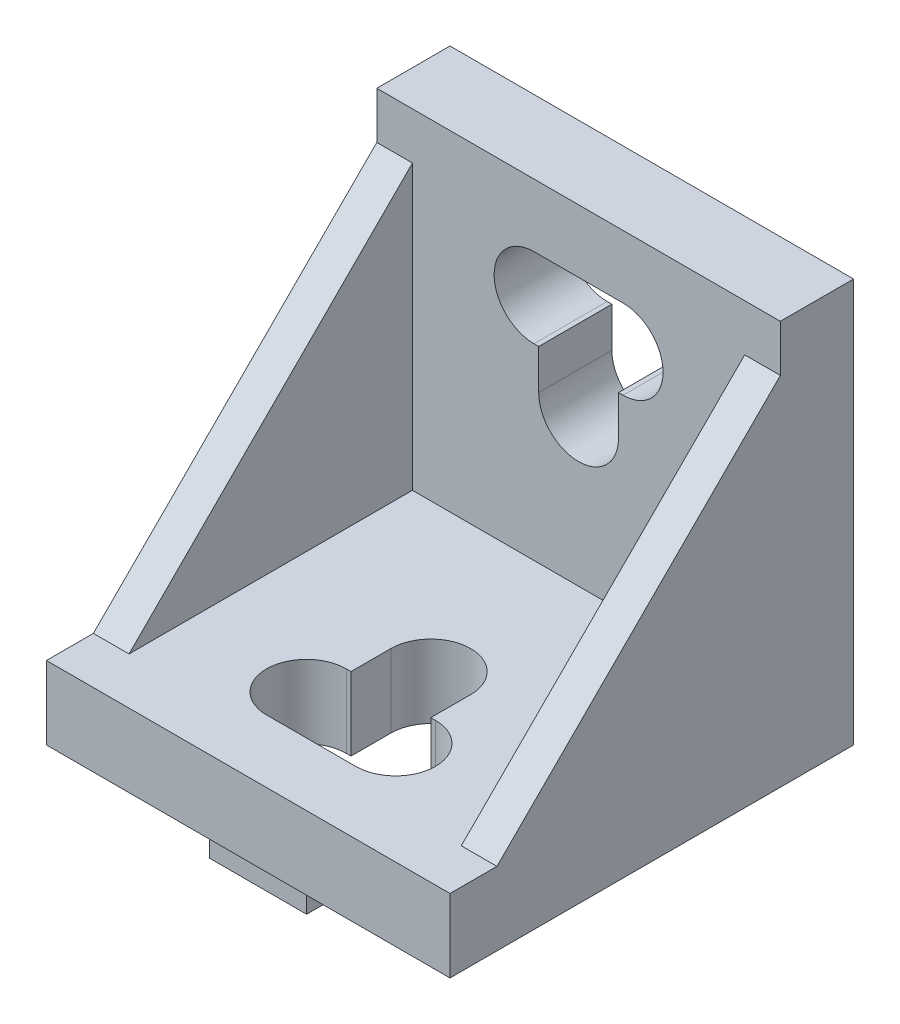
ISO-10303-21;
HEADER;
FILE_DESCRIPTION(('STEP AP214'),'2;1');
FILE_NAME('part.step','',(''),(''),'','','');
FILE_SCHEMA(('AUTOMOTIVE_DESIGN { 1 0 10303 214 1 1 1 1 }'));
ENDSEC;
DATA;
#1=APPLICATION_CONTEXT('core data for automotive mechanical design processes');
#2=APPLICATION_PROTOCOL_DEFINITION('international standard','automotive_design',2000,#1);
#3=PRODUCT_CONTEXT('',#1,'mechanical');
#4=PRODUCT('Part','Part','',(#3));
#5=PRODUCT_RELATED_PRODUCT_CATEGORY('part','',(#4));
#6=PRODUCT_DEFINITION_FORMATION('','',#4);
#7=PRODUCT_DEFINITION_CONTEXT('part definition',#1,'design');
#8=PRODUCT_DEFINITION('design','',#6,#7);
#9=PRODUCT_DEFINITION_SHAPE('','',#8);
#10=(LENGTH_UNIT() NAMED_UNIT(*) SI_UNIT(.MILLI.,.METRE.));
#11=(NAMED_UNIT(*) PLANE_ANGLE_UNIT() SI_UNIT($,.RADIAN.));
#12=(NAMED_UNIT(*) SI_UNIT($,.STERADIAN.) SOLID_ANGLE_UNIT());
#13=UNCERTAINTY_MEASURE_WITH_UNIT(LENGTH_MEASURE(1.E-05),#10,'distance_accuracy_value','');
#14=(GEOMETRIC_REPRESENTATION_CONTEXT(3) GLOBAL_UNCERTAINTY_ASSIGNED_CONTEXT((#13)) GLOBAL_UNIT_ASSIGNED_CONTEXT((#10,
#11,#12)) REPRESENTATION_CONTEXT('',''));
#15=CARTESIAN_POINT('',(0.,0.,0.));
#16=DIRECTION('',(0.,0.,1.));
#17=DIRECTION('',(1.,0.,0.));
#18=AXIS2_PLACEMENT_3D('',#15,#16,#17);
#19=CARTESIAN_POINT('',(-21.5,-21.5,7.8));
#20=DIRECTION('',(0.,1.,0.));
#21=DIRECTION('',(0.,0.,1.));
#22=AXIS2_PLACEMENT_3D('',#19,#20,#21);
#23=PLANE('',#22);
#24=CARTESIAN_POINT('',(0.,-21.5,23.55));
#25=DIRECTION('',(0.,-1.,0.));
#26=DIRECTION('',(1.,0.,0.));
#27=AXIS2_PLACEMENT_3D('',#24,#25,#26);
#28=CIRCLE('',#27,4.25);
#29=CARTESIAN_POINT('',(-4.25,-21.5,23.55));
#30=VERTEX_POINT('',#29);
#31=CARTESIAN_POINT('',(4.25,-21.5,23.55));
#32=VERTEX_POINT('',#31);
#33=EDGE_CURVE('E262',#30,#32,#28,.T.);
#34=ORIENTED_EDGE('',*,*,#33,.F.);
#35=DIRECTION('',(0.,0.,-1.));
#36=VECTOR('',#35,1.);
#37=CARTESIAN_POINT('',(-4.25,-21.5,23.55));
#38=LINE('',#37,#36);
#39=CARTESIAN_POINT('',(-4.25,-21.5,27.8));
#40=VERTEX_POINT('',#39);
#41=EDGE_CURVE('E264',#40,#30,#38,.T.);
#42=ORIENTED_EDGE('',*,*,#41,.F.);
#43=DIRECTION('',(1.,0.,0.));
#44=VECTOR('',#43,1.);
#45=CARTESIAN_POINT('',(-4.25,-21.5,27.8));
#46=LINE('',#45,#44);
#47=CARTESIAN_POINT('',(-4.75,-21.5,27.8));
#48=VERTEX_POINT('',#47);
#49=EDGE_CURVE('E267',#48,#40,#46,.T.);
#50=ORIENTED_EDGE('',*,*,#49,.F.);
#51=CARTESIAN_POINT('',(-4.75,-21.5,32.05));
#52=DIRECTION('',(0.,-1.,0.));
#53=DIRECTION('',(1.,0.,0.));
#54=AXIS2_PLACEMENT_3D('',#51,#52,#53);
#55=CIRCLE('',#54,4.25);
#56=CARTESIAN_POINT('',(-4.75,-21.5,36.3));
#57=VERTEX_POINT('',#56);
#58=EDGE_CURVE('E270',#57,#48,#55,.T.);
#59=ORIENTED_EDGE('',*,*,#58,.F.);
#60=DIRECTION('',(-1.,0.,0.));
#61=VECTOR('',#60,1.);
#62=CARTESIAN_POINT('',(4.75,-21.5,36.3));
#63=LINE('',#62,#61);
#64=CARTESIAN_POINT('',(4.75,-21.5,36.3));
#65=VERTEX_POINT('',#64);
#66=EDGE_CURVE('E272',#65,#57,#63,.T.);
#67=ORIENTED_EDGE('',*,*,#66,.F.);
#68=CARTESIAN_POINT('',(4.75,-21.5,32.05));
#69=DIRECTION('',(0.,-1.,0.));
#70=DIRECTION('',(1.,0.,0.));
#71=AXIS2_PLACEMENT_3D('',#68,#69,#70);
#72=CIRCLE('',#71,4.25);
#73=CARTESIAN_POINT('',(4.75,-21.5,27.8));
#74=VERTEX_POINT('',#73);
#75=EDGE_CURVE('E274',#74,#65,#72,.T.);
#76=ORIENTED_EDGE('',*,*,#75,.F.);
#77=DIRECTION('',(1.,0.,0.));
#78=VECTOR('',#77,1.);
#79=CARTESIAN_POINT('',(4.75,-21.5,27.8));
#80=LINE('',#79,#78);
#81=CARTESIAN_POINT('',(4.25,-21.5,27.8));
#82=VERTEX_POINT('',#81);
#83=EDGE_CURVE('E276',#82,#74,#80,.T.);
#84=ORIENTED_EDGE('',*,*,#83,.F.);
#85=DIRECTION('',(0.,0.,1.));
#86=VECTOR('',#85,1.);
#87=CARTESIAN_POINT('',(4.25,-21.5,23.55));
#88=LINE('',#87,#86);
#89=EDGE_CURVE('E278',#32,#82,#88,.T.);
#90=ORIENTED_EDGE('',*,*,#89,.F.);
#91=EDGE_LOOP('',(#34,#42,#50,#59,#67,#76,#84,#90));
#92=FACE_BOUND('',#91,.T.);
#93=DIRECTION('',(1.,0.,0.));
#94=VECTOR('',#93,1.);
#95=CARTESIAN_POINT('',(-21.5,-21.5,0.));
#96=LINE('',#95,#94);
#97=CARTESIAN_POINT('',(-21.5,-21.5,0.));
#98=VERTEX_POINT('',#97);
#99=CARTESIAN_POINT('',(21.5,-21.5,0.));
#100=VERTEX_POINT('',#99);
#101=EDGE_CURVE('E436',#98,#100,#96,.T.);
#102=ORIENTED_EDGE('',*,*,#101,.T.);
#103=DIRECTION('',(0.,0.,-1.));
#104=VECTOR('',#103,1.);
#105=CARTESIAN_POINT('',(21.5,-21.5,7.8));
#106=LINE('',#105,#104);
#107=CARTESIAN_POINT('',(21.5,-21.5,43.));
#108=VERTEX_POINT('',#107);
#109=EDGE_CURVE('E441',#108,#100,#106,.T.);
#110=ORIENTED_EDGE('',*,*,#109,.F.);
#111=DIRECTION('',(-1.,0.,0.));
#112=VECTOR('',#111,1.);
#113=CARTESIAN_POINT('',(-21.5,-21.5,43.));
#114=LINE('',#113,#112);
#115=CARTESIAN_POINT('',(-21.5,-21.5,43.));
#116=VERTEX_POINT('',#115);
#117=EDGE_CURVE('E410',#108,#116,#114,.T.);
#118=ORIENTED_EDGE('',*,*,#117,.T.);
#119=DIRECTION('',(0.,0.,-1.));
#120=VECTOR('',#119,1.);
#121=CARTESIAN_POINT('',(-21.5,-21.5,7.8));
#122=LINE('',#121,#120);
#123=EDGE_CURVE('E450',#116,#98,#122,.T.);
#124=ORIENTED_EDGE('',*,*,#123,.T.);
#125=EDGE_LOOP('',(#102,#110,#118,#124));
#126=FACE_BOUND('',#125,.T.);
#127=DIRECTION('',(0.,0.,1.));
#128=VECTOR('',#127,1.);
#129=CARTESIAN_POINT('',(5.18251771749756,-21.5,41.9582928297311));
#130=LINE('',#129,#128);
#131=CARTESIAN_POINT('',(5.18251771749756,-21.5,39.1582928297312));
#132=VERTEX_POINT('',#131);
#133=CARTESIAN_POINT('',(5.18251771749756,-21.5,41.9582928297311));
#134=VERTEX_POINT('',#133);
#135=EDGE_CURVE('E252',#132,#134,#130,.T.);
#136=ORIENTED_EDGE('',*,*,#135,.F.);
#137=DIRECTION('',(1.,0.,0.));
#138=VECTOR('',#137,1.);
#139=CARTESIAN_POINT('',(-5.18251771749756,-21.5,39.1582928297312));
#140=LINE('',#139,#138);
#141=CARTESIAN_POINT('',(-5.18251771749756,-21.5,39.1582928297312));
#142=VERTEX_POINT('',#141);
#143=EDGE_CURVE('E249',#142,#132,#140,.T.);
#144=ORIENTED_EDGE('',*,*,#143,.F.);
#145=DIRECTION('',(0.,0.,-1.));
#146=VECTOR('',#145,1.);
#147=CARTESIAN_POINT('',(-5.18251771749756,-21.5,41.9582928297311));
#148=LINE('',#147,#146);
#149=CARTESIAN_POINT('',(-5.18251771749756,-21.5,41.9582928297311));
#150=VERTEX_POINT('',#149);
#151=EDGE_CURVE('E55',#150,#142,#148,.T.);
#152=ORIENTED_EDGE('',*,*,#151,.F.);
#153=DIRECTION('',(-1.,0.,0.));
#154=VECTOR('',#153,1.);
#155=CARTESIAN_POINT('',(-5.18251771749756,-21.5,41.9582928297311));
#156=LINE('',#155,#154);
#157=EDGE_CURVE('E50',#134,#150,#156,.T.);
#158=ORIENTED_EDGE('',*,*,#157,.F.);
#159=EDGE_LOOP('',(#136,#144,#152,#158));
#160=FACE_BOUND('',#159,.T.);
#161=ADVANCED_FACE('F35',(#92,#126,#160),#23,.F.);
#162=CARTESIAN_POINT('',(-21.5,-13.7,43.));
#163=DIRECTION('',(0.,1.,0.));
#164=DIRECTION('',(0.,0.,1.));
#165=AXIS2_PLACEMENT_3D('',#162,#163,#164);
#166=PLANE('',#165);
#167=DIRECTION('',(0.,0.,1.));
#168=VECTOR('',#167,1.);
#169=CARTESIAN_POINT('',(21.5,-13.7,0.));
#170=LINE('',#169,#168);
#171=CARTESIAN_POINT('',(21.5,-13.7,38.));
#172=VERTEX_POINT('',#171);
#173=CARTESIAN_POINT('',(21.5,-13.7,43.));
#174=VERTEX_POINT('',#173);
#175=EDGE_CURVE('E416',#172,#174,#170,.T.);
#176=ORIENTED_EDGE('',*,*,#175,.F.);
#177=DIRECTION('',(1.,0.,0.));
#178=VECTOR('',#177,1.);
#179=CARTESIAN_POINT('',(17.7,-13.7,38.));
#180=LINE('',#179,#178);
#181=CARTESIAN_POINT('',(17.7,-13.7,38.));
#182=VERTEX_POINT('',#181);
#183=EDGE_CURVE('E390',#182,#172,#180,.T.);
#184=ORIENTED_EDGE('',*,*,#183,.F.);
#185=DIRECTION('',(0.,0.,1.));
#186=VECTOR('',#185,1.);
#187=CARTESIAN_POINT('',(17.7,-13.7,7.8));
#188=LINE('',#187,#186);
#189=CARTESIAN_POINT('',(17.7,-13.7,7.8));
#190=VERTEX_POINT('',#189);
#191=EDGE_CURVE('E386',#190,#182,#188,.T.);
#192=ORIENTED_EDGE('',*,*,#191,.F.);
#193=DIRECTION('',(1.,0.,0.));
#194=VECTOR('',#193,1.);
#195=CARTESIAN_POINT('',(21.5,-13.7,7.8));
#196=LINE('',#195,#194);
#197=CARTESIAN_POINT('',(-17.7,-13.7,7.8));
#198=VERTEX_POINT('',#197);
#199=EDGE_CURVE('E427',#198,#190,#196,.T.);
#200=ORIENTED_EDGE('',*,*,#199,.F.);
#201=DIRECTION('',(0.,0.,1.));
#202=VECTOR('',#201,1.);
#203=CARTESIAN_POINT('',(-17.7,-13.7,7.8));
#204=LINE('',#203,#202);
#205=CARTESIAN_POINT('',(-17.7,-13.7,38.));
#206=VERTEX_POINT('',#205);
#207=EDGE_CURVE('E399',#198,#206,#204,.T.);
#208=ORIENTED_EDGE('',*,*,#207,.T.);
#209=DIRECTION('',(-1.,0.,0.));
#210=VECTOR('',#209,1.);
#211=CARTESIAN_POINT('',(-17.7,-13.7,38.));
#212=LINE('',#211,#210);
#213=CARTESIAN_POINT('',(-21.5,-13.7,38.));
#214=VERTEX_POINT('',#213);
#215=EDGE_CURVE('E405',#206,#214,#212,.T.);
#216=ORIENTED_EDGE('',*,*,#215,.T.);
#217=DIRECTION('',(0.,0.,-1.));
#218=VECTOR('',#217,1.);
#219=CARTESIAN_POINT('',(-21.5,-13.7,0.));
#220=LINE('',#219,#218);
#221=CARTESIAN_POINT('',(-21.5,-13.7,43.));
#222=VERTEX_POINT('',#221);
#223=EDGE_CURVE('E413',#222,#214,#220,.T.);
#224=ORIENTED_EDGE('',*,*,#223,.F.);
#225=DIRECTION('',(-1.,0.,0.));
#226=VECTOR('',#225,1.);
#227=CARTESIAN_POINT('',(-21.5,-13.7,43.));
#228=LINE('',#227,#226);
#229=EDGE_CURVE('E418',#174,#222,#228,.T.);
#230=ORIENTED_EDGE('',*,*,#229,.F.);
#231=EDGE_LOOP('',(#176,#184,#192,#200,#208,#216,#224,#230));
#232=FACE_BOUND('',#231,.T.);
#233=DIRECTION('',(0.,0.,-1.));
#234=VECTOR('',#233,1.);
#235=CARTESIAN_POINT('',(-4.25,-13.7,23.55));
#236=LINE('',#235,#234);
#237=CARTESIAN_POINT('',(-4.25,-13.7,27.8));
#238=VERTEX_POINT('',#237);
#239=CARTESIAN_POINT('',(-4.25,-13.7,23.55));
#240=VERTEX_POINT('',#239);
#241=EDGE_CURVE('E256',#238,#240,#236,.T.);
#242=ORIENTED_EDGE('',*,*,#241,.T.);
#243=CARTESIAN_POINT('',(0.,-13.7,23.55));
#244=DIRECTION('',(0.,-1.,0.));
#245=DIRECTION('',(1.,0.,0.));
#246=AXIS2_PLACEMENT_3D('',#243,#244,#245);
#247=CIRCLE('',#246,4.25);
#248=CARTESIAN_POINT('',(4.25,-13.7,23.55));
#249=VERTEX_POINT('',#248);
#250=EDGE_CURVE('E253',#240,#249,#247,.T.);
#251=ORIENTED_EDGE('',*,*,#250,.T.);
#252=DIRECTION('',(0.,0.,1.));
#253=VECTOR('',#252,1.);
#254=CARTESIAN_POINT('',(4.25,-13.7,23.55));
#255=LINE('',#254,#253);
#256=CARTESIAN_POINT('',(4.25,-13.7,27.8));
#257=VERTEX_POINT('',#256);
#258=EDGE_CURVE('E265',#249,#257,#255,.T.);
#259=ORIENTED_EDGE('',*,*,#258,.T.);
#260=DIRECTION('',(1.,0.,0.));
#261=VECTOR('',#260,1.);
#262=CARTESIAN_POINT('',(4.75,-13.7,27.8));
#263=LINE('',#262,#261);
#264=CARTESIAN_POINT('',(4.75,-13.7,27.8));
#265=VERTEX_POINT('',#264);
#266=EDGE_CURVE('E295',#257,#265,#263,.T.);
#267=ORIENTED_EDGE('',*,*,#266,.T.);
#268=CARTESIAN_POINT('',(4.75,-13.7,32.05));
#269=DIRECTION('',(0.,-1.,0.));
#270=DIRECTION('',(1.,0.,0.));
#271=AXIS2_PLACEMENT_3D('',#268,#269,#270);
#272=CIRCLE('',#271,4.25);
#273=CARTESIAN_POINT('',(4.75,-13.7,36.3));
#274=VERTEX_POINT('',#273);
#275=EDGE_CURVE('E292',#265,#274,#272,.T.);
#276=ORIENTED_EDGE('',*,*,#275,.T.);
#277=DIRECTION('',(-1.,0.,0.));
#278=VECTOR('',#277,1.);
#279=CARTESIAN_POINT('',(4.75,-13.7,36.3));
#280=LINE('',#279,#278);
#281=CARTESIAN_POINT('',(-4.75,-13.7,36.3));
#282=VERTEX_POINT('',#281);
#283=EDGE_CURVE('E289',#274,#282,#280,.T.);
#284=ORIENTED_EDGE('',*,*,#283,.T.);
#285=CARTESIAN_POINT('',(-4.75,-13.7,32.05));
#286=DIRECTION('',(0.,-1.,0.));
#287=DIRECTION('',(1.,0.,0.));
#288=AXIS2_PLACEMENT_3D('',#285,#286,#287);
#289=CIRCLE('',#288,4.25);
#290=CARTESIAN_POINT('',(-4.75,-13.7,27.8));
#291=VERTEX_POINT('',#290);
#292=EDGE_CURVE('E286',#282,#291,#289,.T.);
#293=ORIENTED_EDGE('',*,*,#292,.T.);
#294=DIRECTION('',(1.,0.,0.));
#295=VECTOR('',#294,1.);
#296=CARTESIAN_POINT('',(-4.25,-13.7,27.8));
#297=LINE('',#296,#295);
#298=EDGE_CURVE('E283',#291,#238,#297,.T.);
#299=ORIENTED_EDGE('',*,*,#298,.T.);
#300=EDGE_LOOP('',(#242,#251,#259,#267,#276,#284,#293,#299));
#301=FACE_BOUND('',#300,.T.);
#302=ADVANCED_FACE('F477',(#232,#301),#166,.T.);
#303=CARTESIAN_POINT('',(21.5,21.5,7.8));
#304=DIRECTION('',(0.,0.,-1.));
#305=DIRECTION('',(-1.,0.,0.));
#306=AXIS2_PLACEMENT_3D('',#303,#304,#305);
#307=PLANE('',#306);
#308=DIRECTION('',(0.,1.,0.));
#309=VECTOR('',#308,1.);
#310=CARTESIAN_POINT('',(4.25,2.05,7.8));
#311=LINE('',#310,#309);
#312=CARTESIAN_POINT('',(4.25,2.05,7.8));
#313=VERTEX_POINT('',#312);
#314=CARTESIAN_POINT('',(4.25,6.3,7.8));
#315=VERTEX_POINT('',#314);
#316=EDGE_CURVE('E345',#313,#315,#311,.T.);
#317=ORIENTED_EDGE('',*,*,#316,.F.);
#318=CARTESIAN_POINT('',(0.,2.05,7.8));
#319=DIRECTION('',(0.,0.,1.));
#320=DIRECTION('',(1.,0.,0.));
#321=AXIS2_PLACEMENT_3D('',#318,#319,#320);
#322=CIRCLE('',#321,4.25);
#323=CARTESIAN_POINT('',(-4.25,2.05,7.8));
#324=VERTEX_POINT('',#323);
#325=EDGE_CURVE('E303',#324,#313,#322,.T.);
#326=ORIENTED_EDGE('',*,*,#325,.F.);
#327=DIRECTION('',(0.,-1.,0.));
#328=VECTOR('',#327,1.);
#329=CARTESIAN_POINT('',(-4.25,2.05,7.8));
#330=LINE('',#329,#328);
#331=CARTESIAN_POINT('',(-4.25,6.3,7.8));
#332=VERTEX_POINT('',#331);
#333=EDGE_CURVE('E322',#332,#324,#330,.T.);
#334=ORIENTED_EDGE('',*,*,#333,.F.);
#335=DIRECTION('',(1.,0.,0.));
#336=VECTOR('',#335,1.);
#337=CARTESIAN_POINT('',(-4.25,6.3,7.8));
#338=LINE('',#337,#336);
#339=CARTESIAN_POINT('',(-4.75,6.3,7.8));
#340=VERTEX_POINT('',#339);
#341=EDGE_CURVE('E360',#340,#332,#338,.T.);
#342=ORIENTED_EDGE('',*,*,#341,.F.);
#343=CARTESIAN_POINT('',(-4.75,10.55,7.8));
#344=DIRECTION('',(0.,0.,1.));
#345=DIRECTION('',(1.,0.,0.));
#346=AXIS2_PLACEMENT_3D('',#343,#344,#345);
#347=CIRCLE('',#346,4.25);
#348=CARTESIAN_POINT('',(-4.75,14.8,7.8));
#349=VERTEX_POINT('',#348);
#350=EDGE_CURVE('E357',#349,#340,#347,.T.);
#351=ORIENTED_EDGE('',*,*,#350,.F.);
#352=DIRECTION('',(-1.,0.,0.));
#353=VECTOR('',#352,1.);
#354=CARTESIAN_POINT('',(4.75,14.8,7.8));
#355=LINE('',#354,#353);
#356=CARTESIAN_POINT('',(4.75,14.8,7.8));
#357=VERTEX_POINT('',#356);
#358=EDGE_CURVE('E354',#357,#349,#355,.T.);
#359=ORIENTED_EDGE('',*,*,#358,.F.);
#360=CARTESIAN_POINT('',(4.75,10.55,7.8));
#361=DIRECTION('',(0.,0.,1.));
#362=DIRECTION('',(1.,0.,0.));
#363=AXIS2_PLACEMENT_3D('',#360,#361,#362);
#364=CIRCLE('',#363,4.25);
#365=CARTESIAN_POINT('',(4.75,6.3,7.8));
#366=VERTEX_POINT('',#365);
#367=EDGE_CURVE('E351',#366,#357,#364,.T.);
#368=ORIENTED_EDGE('',*,*,#367,.F.);
#369=DIRECTION('',(1.,0.,0.));
#370=VECTOR('',#369,1.);
#371=CARTESIAN_POINT('',(4.75,6.3,7.8));
#372=LINE('',#371,#370);
#373=EDGE_CURVE('E348',#315,#366,#372,.T.);
#374=ORIENTED_EDGE('',*,*,#373,.F.);
#375=EDGE_LOOP('',(#317,#326,#334,#342,#351,#359,#368,#374));
#376=FACE_BOUND('',#375,.T.);
#377=DIRECTION('',(1.,0.,0.));
#378=VECTOR('',#377,1.);
#379=CARTESIAN_POINT('',(17.7,16.5,7.8));
#380=LINE('',#379,#378);
#381=CARTESIAN_POINT('',(17.7,16.5,7.8));
#382=VERTEX_POINT('',#381);
#383=CARTESIAN_POINT('',(21.5,16.5,7.8));
#384=VERTEX_POINT('',#383);
#385=EDGE_CURVE('E388',#382,#384,#380,.T.);
#386=ORIENTED_EDGE('',*,*,#385,.T.);
#387=DIRECTION('',(0.,1.,0.));
#388=VECTOR('',#387,1.);
#389=CARTESIAN_POINT('',(21.5,-21.5,7.8));
#390=LINE('',#389,#388);
#391=CARTESIAN_POINT('',(21.5,21.5,7.8));
#392=VERTEX_POINT('',#391);
#393=EDGE_CURVE('E433',#384,#392,#390,.T.);
#394=ORIENTED_EDGE('',*,*,#393,.T.);
#395=DIRECTION('',(-1.,0.,0.));
#396=VECTOR('',#395,1.);
#397=CARTESIAN_POINT('',(-21.5,21.5,7.8));
#398=LINE('',#397,#396);
#399=CARTESIAN_POINT('',(-21.5,21.5,7.8));
#400=VERTEX_POINT('',#399);
#401=EDGE_CURVE('E435',#392,#400,#398,.T.);
#402=ORIENTED_EDGE('',*,*,#401,.T.);
#403=DIRECTION('',(0.,-1.,0.));
#404=VECTOR('',#403,1.);
#405=CARTESIAN_POINT('',(-21.5,-21.5,7.8));
#406=LINE('',#405,#404);
#407=CARTESIAN_POINT('',(-21.5,16.5,7.8));
#408=VERTEX_POINT('',#407);
#409=EDGE_CURVE('E438',#400,#408,#406,.T.);
#410=ORIENTED_EDGE('',*,*,#409,.T.);
#411=DIRECTION('',(-1.,0.,0.));
#412=VECTOR('',#411,1.);
#413=CARTESIAN_POINT('',(-17.7,16.5,7.8));
#414=LINE('',#413,#412);
#415=CARTESIAN_POINT('',(-17.7,16.5,7.8));
#416=VERTEX_POINT('',#415);
#417=EDGE_CURVE('E408',#416,#408,#414,.T.);
#418=ORIENTED_EDGE('',*,*,#417,.F.);
#419=DIRECTION('',(0.,-1.,0.));
#420=VECTOR('',#419,1.);
#421=CARTESIAN_POINT('',(-17.7,16.5,7.8));
#422=LINE('',#421,#420);
#423=EDGE_CURVE('E396',#416,#198,#422,.T.);
#424=ORIENTED_EDGE('',*,*,#423,.T.);
#425=ORIENTED_EDGE('',*,*,#199,.T.);
#426=DIRECTION('',(0.,-1.,0.));
#427=VECTOR('',#426,1.);
#428=CARTESIAN_POINT('',(17.7,16.5,7.8));
#429=LINE('',#428,#427);
#430=EDGE_CURVE('E382',#382,#190,#429,.T.);
#431=ORIENTED_EDGE('',*,*,#430,.F.);
#432=EDGE_LOOP('',(#386,#394,#402,#410,#418,#424,#425,#431));
#433=FACE_BOUND('',#432,.T.);
#434=ADVANCED_FACE('F487',(#376,#433),#307,.F.);
#435=CARTESIAN_POINT('',(21.5,-21.5,7.8));
#436=DIRECTION('',(-1.,0.,0.));
#437=DIRECTION('',(0.,0.,1.));
#438=AXIS2_PLACEMENT_3D('',#435,#436,#437);
#439=PLANE('',#438);
#440=ORIENTED_EDGE('',*,*,#393,.F.);
#441=DIRECTION('',(0.,0.707106781186548,-0.707106781186548));
#442=VECTOR('',#441,1.);
#443=CARTESIAN_POINT('',(21.5,16.5,7.8));
#444=LINE('',#443,#442);
#445=EDGE_CURVE('E367',#172,#384,#444,.T.);
#446=ORIENTED_EDGE('',*,*,#445,.F.);
#447=ORIENTED_EDGE('',*,*,#175,.T.);
#448=DIRECTION('',(0.,-1.,0.));
#449=VECTOR('',#448,1.);
#450=CARTESIAN_POINT('',(21.5,-13.7,43.));
#451=LINE('',#450,#449);
#452=EDGE_CURVE('E421',#174,#108,#451,.T.);
#453=ORIENTED_EDGE('',*,*,#452,.T.);
#454=ORIENTED_EDGE('',*,*,#109,.T.);
#455=DIRECTION('',(0.,1.,0.));
#456=VECTOR('',#455,1.);
#457=CARTESIAN_POINT('',(21.5,-21.5,0.));
#458=LINE('',#457,#456);
#459=CARTESIAN_POINT('',(21.5,21.5,0.));
#460=VERTEX_POINT('',#459);
#461=EDGE_CURVE('E432',#100,#460,#458,.T.);
#462=ORIENTED_EDGE('',*,*,#461,.T.);
#463=DIRECTION('',(0.,0.,-1.));
#464=VECTOR('',#463,1.);
#465=CARTESIAN_POINT('',(21.5,21.5,7.8));
#466=LINE('',#465,#464);
#467=EDGE_CURVE('E11',#392,#460,#466,.T.);
#468=ORIENTED_EDGE('',*,*,#467,.F.);
#469=EDGE_LOOP('',(#440,#446,#447,#453,#454,#462,#468));
#470=FACE_BOUND('',#469,.T.);
#471=ADVANCED_FACE('F37',(#470),#439,.F.);
#472=CARTESIAN_POINT('',(-21.5,21.5,7.8));
#473=DIRECTION('',(0.,-1.,0.));
#474=DIRECTION('',(0.,0.,-1.));
#475=AXIS2_PLACEMENT_3D('',#472,#473,#474);
#476=PLANE('',#475);
#477=DIRECTION('',(-1.,0.,0.));
#478=VECTOR('',#477,1.);
#479=CARTESIAN_POINT('',(-21.5,21.5,0.));
#480=LINE('',#479,#478);
#481=CARTESIAN_POINT('',(-21.5,21.5,0.));
#482=VERTEX_POINT('',#481);
#483=EDGE_CURVE('E443',#460,#482,#480,.T.);
#484=ORIENTED_EDGE('',*,*,#483,.T.);
#485=DIRECTION('',(0.,0.,-1.));
#486=VECTOR('',#485,1.);
#487=CARTESIAN_POINT('',(-21.5,21.5,7.8));
#488=LINE('',#487,#486);
#489=EDGE_CURVE('E43',#400,#482,#488,.T.);
#490=ORIENTED_EDGE('',*,*,#489,.F.);
#491=ORIENTED_EDGE('',*,*,#401,.F.);
#492=ORIENTED_EDGE('',*,*,#467,.T.);
#493=EDGE_LOOP('',(#484,#490,#491,#492));
#494=FACE_BOUND('',#493,.T.);
#495=ADVANCED_FACE('F497',(#494),#476,.F.);
#496=CARTESIAN_POINT('',(-21.5,-21.5,7.8));
#497=DIRECTION('',(1.,0.,0.));
#498=DIRECTION('',(0.,0.,-1.));
#499=AXIS2_PLACEMENT_3D('',#496,#497,#498);
#500=PLANE('',#499);
#501=DIRECTION('',(0.,-1.,0.));
#502=VECTOR('',#501,1.);
#503=CARTESIAN_POINT('',(-21.5,-21.5,0.));
#504=LINE('',#503,#502);
#505=EDGE_CURVE('E445',#482,#98,#504,.T.);
#506=ORIENTED_EDGE('',*,*,#505,.T.);
#507=ORIENTED_EDGE('',*,*,#123,.F.);
#508=DIRECTION('',(0.,-1.,0.));
#509=VECTOR('',#508,1.);
#510=CARTESIAN_POINT('',(-21.5,-13.7,43.));
#511=LINE('',#510,#509);
#512=EDGE_CURVE('E424',#222,#116,#511,.T.);
#513=ORIENTED_EDGE('',*,*,#512,.F.);
#514=ORIENTED_EDGE('',*,*,#223,.T.);
#515=DIRECTION('',(0.,0.707106781186548,-0.707106781186548));
#516=VECTOR('',#515,1.);
#517=CARTESIAN_POINT('',(-21.5,16.5,7.8));
#518=LINE('',#517,#516);
#519=EDGE_CURVE('E393',#214,#408,#518,.T.);
#520=ORIENTED_EDGE('',*,*,#519,.T.);
#521=ORIENTED_EDGE('',*,*,#409,.F.);
#522=ORIENTED_EDGE('',*,*,#489,.T.);
#523=EDGE_LOOP('',(#506,#507,#513,#514,#520,#521,#522));
#524=FACE_BOUND('',#523,.T.);
#525=ADVANCED_FACE('F457',(#524),#500,.F.);
#526=CARTESIAN_POINT('',(21.5,21.5,0.));
#527=DIRECTION('',(0.,0.,-1.));
#528=DIRECTION('',(-1.,0.,0.));
#529=AXIS2_PLACEMENT_3D('',#526,#527,#528);
#530=PLANE('',#529);
#531=CARTESIAN_POINT('',(0.,2.05,0.));
#532=DIRECTION('',(0.,0.,1.));
#533=DIRECTION('',(1.,0.,0.));
#534=AXIS2_PLACEMENT_3D('',#531,#532,#533);
#535=CIRCLE('',#534,4.25);
#536=CARTESIAN_POINT('',(-4.25,2.05,0.));
#537=VERTEX_POINT('',#536);
#538=CARTESIAN_POINT('',(4.25,2.05,0.));
#539=VERTEX_POINT('',#538);
#540=EDGE_CURVE('E318',#537,#539,#535,.T.);
#541=ORIENTED_EDGE('',*,*,#540,.T.);
#542=DIRECTION('',(0.,1.,0.));
#543=VECTOR('',#542,1.);
#544=CARTESIAN_POINT('',(4.25,2.05,0.));
#545=LINE('',#544,#543);
#546=CARTESIAN_POINT('',(4.25,6.3,0.));
#547=VERTEX_POINT('',#546);
#548=EDGE_CURVE('E321',#539,#547,#545,.T.);
#549=ORIENTED_EDGE('',*,*,#548,.T.);
#550=DIRECTION('',(1.,0.,0.));
#551=VECTOR('',#550,1.);
#552=CARTESIAN_POINT('',(4.75,6.3,0.));
#553=LINE('',#552,#551);
#554=CARTESIAN_POINT('',(4.75,6.3,0.));
#555=VERTEX_POINT('',#554);
#556=EDGE_CURVE('E325',#547,#555,#553,.T.);
#557=ORIENTED_EDGE('',*,*,#556,.T.);
#558=CARTESIAN_POINT('',(4.75,10.55,0.));
#559=DIRECTION('',(0.,0.,1.));
#560=DIRECTION('',(1.,0.,0.));
#561=AXIS2_PLACEMENT_3D('',#558,#559,#560);
#562=CIRCLE('',#561,4.25);
#563=CARTESIAN_POINT('',(4.75,14.8,0.));
#564=VERTEX_POINT('',#563);
#565=EDGE_CURVE('E328',#555,#564,#562,.T.);
#566=ORIENTED_EDGE('',*,*,#565,.T.);
#567=DIRECTION('',(-1.,0.,0.));
#568=VECTOR('',#567,1.);
#569=CARTESIAN_POINT('',(4.75,14.8,0.));
#570=LINE('',#569,#568);
#571=CARTESIAN_POINT('',(-4.75,14.8,0.));
#572=VERTEX_POINT('',#571);
#573=EDGE_CURVE('E331',#564,#572,#570,.T.);
#574=ORIENTED_EDGE('',*,*,#573,.T.);
#575=CARTESIAN_POINT('',(-4.75,10.55,0.));
#576=DIRECTION('',(0.,0.,1.));
#577=DIRECTION('',(1.,0.,0.));
#578=AXIS2_PLACEMENT_3D('',#575,#576,#577);
#579=CIRCLE('',#578,4.25);
#580=CARTESIAN_POINT('',(-4.75,6.3,0.));
#581=VERTEX_POINT('',#580);
#582=EDGE_CURVE('E334',#572,#581,#579,.T.);
#583=ORIENTED_EDGE('',*,*,#582,.T.);
#584=DIRECTION('',(1.,0.,0.));
#585=VECTOR('',#584,1.);
#586=CARTESIAN_POINT('',(-4.25,6.3,0.));
#587=LINE('',#586,#585);
#588=CARTESIAN_POINT('',(-4.25,6.3,0.));
#589=VERTEX_POINT('',#588);
#590=EDGE_CURVE('E337',#581,#589,#587,.T.);
#591=ORIENTED_EDGE('',*,*,#590,.T.);
#592=DIRECTION('',(0.,-1.,0.));
#593=VECTOR('',#592,1.);
#594=CARTESIAN_POINT('',(-4.25,2.05,0.));
#595=LINE('',#594,#593);
#596=EDGE_CURVE('E340',#589,#537,#595,.T.);
#597=ORIENTED_EDGE('',*,*,#596,.T.);
#598=EDGE_LOOP('',(#541,#549,#557,#566,#574,#583,#591,#597));
#599=FACE_BOUND('',#598,.T.);
#600=ORIENTED_EDGE('',*,*,#483,.F.);
#601=ORIENTED_EDGE('',*,*,#461,.F.);
#602=ORIENTED_EDGE('',*,*,#101,.F.);
#603=ORIENTED_EDGE('',*,*,#505,.F.);
#604=EDGE_LOOP('',(#600,#601,#602,#603));
#605=FACE_BOUND('',#604,.T.);
#606=ADVANCED_FACE('F463',(#599,#605),#530,.T.);
#607=CARTESIAN_POINT('',(-21.5,-13.7,43.));
#608=DIRECTION('',(0.,0.,1.));
#609=DIRECTION('',(1.,0.,0.));
#610=AXIS2_PLACEMENT_3D('',#607,#608,#609);
#611=PLANE('',#610);
#612=ORIENTED_EDGE('',*,*,#117,.F.);
#613=ORIENTED_EDGE('',*,*,#452,.F.);
#614=ORIENTED_EDGE('',*,*,#229,.T.);
#615=ORIENTED_EDGE('',*,*,#512,.T.);
#616=EDGE_LOOP('',(#612,#613,#614,#615));
#617=FACE_BOUND('',#616,.T.);
#618=ADVANCED_FACE('F474',(#617),#611,.T.);
#619=CARTESIAN_POINT('',(-17.7,16.5,7.8));
#620=DIRECTION('',(0.,0.707106781186547,0.707106781186547));
#621=DIRECTION('',(0.,-0.707106781186548,0.707106781186548));
#622=AXIS2_PLACEMENT_3D('',#619,#620,#621);
#623=PLANE('',#622);
#624=ORIENTED_EDGE('',*,*,#519,.F.);
#625=ORIENTED_EDGE('',*,*,#215,.F.);
#626=DIRECTION('',(0.,0.707106781186548,-0.707106781186548));
#627=VECTOR('',#626,1.);
#628=CARTESIAN_POINT('',(-17.7,16.5,7.8));
#629=LINE('',#628,#627);
#630=EDGE_CURVE('E402',#206,#416,#629,.T.);
#631=ORIENTED_EDGE('',*,*,#630,.T.);
#632=ORIENTED_EDGE('',*,*,#417,.T.);
#633=EDGE_LOOP('',(#624,#625,#631,#632));
#634=FACE_BOUND('',#633,.T.);
#635=ADVANCED_FACE('F482',(#634),#623,.T.);
#636=CARTESIAN_POINT('',(-17.7,-13.7,7.8));
#637=DIRECTION('',(-1.,0.,0.));
#638=DIRECTION('',(0.,0.,1.));
#639=AXIS2_PLACEMENT_3D('',#636,#637,#638);
#640=PLANE('',#639);
#641=ORIENTED_EDGE('',*,*,#423,.F.);
#642=ORIENTED_EDGE('',*,*,#630,.F.);
#643=ORIENTED_EDGE('',*,*,#207,.F.);
#644=EDGE_LOOP('',(#641,#642,#643));
#645=FACE_BOUND('',#644,.T.);
#646=ADVANCED_FACE('F485',(#645),#640,.F.);
#647=CARTESIAN_POINT('',(17.7,16.5,7.8));
#648=DIRECTION('',(0.,-0.707106781186547,-0.707106781186547));
#649=DIRECTION('',(0.,0.707106781186548,-0.707106781186548));
#650=AXIS2_PLACEMENT_3D('',#647,#648,#649);
#651=PLANE('',#650);
#652=ORIENTED_EDGE('',*,*,#445,.T.);
#653=ORIENTED_EDGE('',*,*,#385,.F.);
#654=DIRECTION('',(0.,0.707106781186548,-0.707106781186548));
#655=VECTOR('',#654,1.);
#656=CARTESIAN_POINT('',(17.7,16.5,7.8));
#657=LINE('',#656,#655);
#658=EDGE_CURVE('E384',#182,#382,#657,.T.);
#659=ORIENTED_EDGE('',*,*,#658,.F.);
#660=ORIENTED_EDGE('',*,*,#183,.T.);
#661=EDGE_LOOP('',(#652,#653,#659,#660));
#662=FACE_BOUND('',#661,.T.);
#663=ADVANCED_FACE('F496',(#662),#651,.F.);
#664=CARTESIAN_POINT('',(17.7,-13.7,7.8));
#665=DIRECTION('',(1.,0.,0.));
#666=DIRECTION('',(0.,0.,1.));
#667=AXIS2_PLACEMENT_3D('',#664,#665,#666);
#668=PLANE('',#667);
#669=ORIENTED_EDGE('',*,*,#430,.T.);
#670=ORIENTED_EDGE('',*,*,#191,.T.);
#671=ORIENTED_EDGE('',*,*,#658,.T.);
#672=EDGE_LOOP('',(#669,#670,#671));
#673=FACE_BOUND('',#672,.T.);
#674=ADVANCED_FACE('F493',(#673),#668,.F.);
#675=CARTESIAN_POINT('',(0.,2.05,0.));
#676=DIRECTION('',(0.,0.,1.));
#677=DIRECTION('',(1.,0.,0.));
#678=AXIS2_PLACEMENT_3D('',#675,#676,#677);
#679=CYLINDRICAL_SURFACE('',#678,4.25);
#680=ORIENTED_EDGE('',*,*,#325,.T.);
#681=DIRECTION('',(0.,0.,1.));
#682=VECTOR('',#681,1.);
#683=CARTESIAN_POINT('',(4.25,2.05,0.));
#684=LINE('',#683,#682);
#685=EDGE_CURVE('E343',#539,#313,#684,.T.);
#686=ORIENTED_EDGE('',*,*,#685,.F.);
#687=ORIENTED_EDGE('',*,*,#540,.F.);
#688=DIRECTION('',(0.,0.,1.));
#689=VECTOR('',#688,1.);
#690=CARTESIAN_POINT('',(-4.25,2.05,0.));
#691=LINE('',#690,#689);
#692=EDGE_CURVE('E365',#537,#324,#691,.T.);
#693=ORIENTED_EDGE('',*,*,#692,.T.);
#694=EDGE_LOOP('',(#680,#686,#687,#693));
#695=FACE_BOUND('',#694,.T.);
#696=ADVANCED_FACE('F529',(#695),#679,.F.);
#697=CARTESIAN_POINT('',(-4.25,2.05,0.));
#698=DIRECTION('',(-1.,0.,0.));
#699=DIRECTION('',(0.,0.,1.));
#700=AXIS2_PLACEMENT_3D('',#697,#698,#699);
#701=PLANE('',#700);
#702=ORIENTED_EDGE('',*,*,#333,.T.);
#703=ORIENTED_EDGE('',*,*,#692,.F.);
#704=ORIENTED_EDGE('',*,*,#596,.F.);
#705=DIRECTION('',(0.,0.,1.));
#706=VECTOR('',#705,1.);
#707=CARTESIAN_POINT('',(-4.25,6.3,0.));
#708=LINE('',#707,#706);
#709=EDGE_CURVE('E368',#589,#332,#708,.T.);
#710=ORIENTED_EDGE('',*,*,#709,.T.);
#711=EDGE_LOOP('',(#702,#703,#704,#710));
#712=FACE_BOUND('',#711,.T.);
#713=ADVANCED_FACE('F532',(#712),#701,.F.);
#714=CARTESIAN_POINT('',(-4.25,6.3,0.));
#715=DIRECTION('',(0.,-1.,0.));
#716=DIRECTION('',(0.,0.,-1.));
#717=AXIS2_PLACEMENT_3D('',#714,#715,#716);
#718=PLANE('',#717);
#719=ORIENTED_EDGE('',*,*,#341,.T.);
#720=ORIENTED_EDGE('',*,*,#709,.F.);
#721=ORIENTED_EDGE('',*,*,#590,.F.);
#722=DIRECTION('',(0.,0.,1.));
#723=VECTOR('',#722,1.);
#724=CARTESIAN_POINT('',(-4.75,6.3,0.));
#725=LINE('',#724,#723);
#726=EDGE_CURVE('E370',#581,#340,#725,.T.);
#727=ORIENTED_EDGE('',*,*,#726,.T.);
#728=EDGE_LOOP('',(#719,#720,#721,#727));
#729=FACE_BOUND('',#728,.T.);
#730=ADVANCED_FACE('F554',(#729),#718,.F.);
#731=CARTESIAN_POINT('',(-4.75,10.55,0.));
#732=DIRECTION('',(0.,0.,1.));
#733=DIRECTION('',(1.,0.,0.));
#734=AXIS2_PLACEMENT_3D('',#731,#732,#733);
#735=CYLINDRICAL_SURFACE('',#734,4.25);
#736=ORIENTED_EDGE('',*,*,#350,.T.);
#737=ORIENTED_EDGE('',*,*,#726,.F.);
#738=ORIENTED_EDGE('',*,*,#582,.F.);
#739=DIRECTION('',(0.,0.,1.));
#740=VECTOR('',#739,1.);
#741=CARTESIAN_POINT('',(-4.75,14.8,0.));
#742=LINE('',#741,#740);
#743=EDGE_CURVE('E372',#572,#349,#742,.T.);
#744=ORIENTED_EDGE('',*,*,#743,.T.);
#745=EDGE_LOOP('',(#736,#737,#738,#744));
#746=FACE_BOUND('',#745,.T.);
#747=ADVANCED_FACE('F550',(#746),#735,.F.);
#748=CARTESIAN_POINT('',(4.75,14.8,0.));
#749=DIRECTION('',(0.,1.,0.));
#750=DIRECTION('',(0.,0.,1.));
#751=AXIS2_PLACEMENT_3D('',#748,#749,#750);
#752=PLANE('',#751);
#753=ORIENTED_EDGE('',*,*,#358,.T.);
#754=ORIENTED_EDGE('',*,*,#743,.F.);
#755=ORIENTED_EDGE('',*,*,#573,.F.);
#756=DIRECTION('',(0.,0.,1.));
#757=VECTOR('',#756,1.);
#758=CARTESIAN_POINT('',(4.75,14.8,0.));
#759=LINE('',#758,#757);
#760=EDGE_CURVE('E374',#564,#357,#759,.T.);
#761=ORIENTED_EDGE('',*,*,#760,.T.);
#762=EDGE_LOOP('',(#753,#754,#755,#761));
#763=FACE_BOUND('',#762,.T.);
#764=ADVANCED_FACE('F546',(#763),#752,.F.);
#765=CARTESIAN_POINT('',(4.75,10.55,0.));
#766=DIRECTION('',(0.,0.,1.));
#767=DIRECTION('',(1.,0.,0.));
#768=AXIS2_PLACEMENT_3D('',#765,#766,#767);
#769=CYLINDRICAL_SURFACE('',#768,4.25);
#770=ORIENTED_EDGE('',*,*,#367,.T.);
#771=ORIENTED_EDGE('',*,*,#760,.F.);
#772=ORIENTED_EDGE('',*,*,#565,.F.);
#773=DIRECTION('',(0.,0.,1.));
#774=VECTOR('',#773,1.);
#775=CARTESIAN_POINT('',(4.75,6.3,0.));
#776=LINE('',#775,#774);
#777=EDGE_CURVE('E376',#555,#366,#776,.T.);
#778=ORIENTED_EDGE('',*,*,#777,.T.);
#779=EDGE_LOOP('',(#770,#771,#772,#778));
#780=FACE_BOUND('',#779,.T.);
#781=ADVANCED_FACE('F542',(#780),#769,.F.);
#782=CARTESIAN_POINT('',(4.75,6.3,0.));
#783=DIRECTION('',(0.,-1.,0.));
#784=DIRECTION('',(0.,0.,-1.));
#785=AXIS2_PLACEMENT_3D('',#782,#783,#784);
#786=PLANE('',#785);
#787=ORIENTED_EDGE('',*,*,#373,.T.);
#788=ORIENTED_EDGE('',*,*,#777,.F.);
#789=ORIENTED_EDGE('',*,*,#556,.F.);
#790=DIRECTION('',(0.,0.,1.));
#791=VECTOR('',#790,1.);
#792=CARTESIAN_POINT('',(4.25,6.3,0.));
#793=LINE('',#792,#791);
#794=EDGE_CURVE('E378',#547,#315,#793,.T.);
#795=ORIENTED_EDGE('',*,*,#794,.T.);
#796=EDGE_LOOP('',(#787,#788,#789,#795));
#797=FACE_BOUND('',#796,.T.);
#798=ADVANCED_FACE('F538',(#797),#786,.F.);
#799=CARTESIAN_POINT('',(4.25,2.05,0.));
#800=DIRECTION('',(1.,0.,0.));
#801=DIRECTION('',(0.,0.,-1.));
#802=AXIS2_PLACEMENT_3D('',#799,#800,#801);
#803=PLANE('',#802);
#804=ORIENTED_EDGE('',*,*,#316,.T.);
#805=ORIENTED_EDGE('',*,*,#794,.F.);
#806=ORIENTED_EDGE('',*,*,#548,.F.);
#807=ORIENTED_EDGE('',*,*,#685,.T.);
#808=EDGE_LOOP('',(#804,#805,#806,#807));
#809=FACE_BOUND('',#808,.T.);
#810=ADVANCED_FACE('F534',(#809),#803,.F.);
#811=CARTESIAN_POINT('',(0.,-21.5,23.55));
#812=DIRECTION('',(0.,1.,0.));
#813=DIRECTION('',(0.,0.,1.));
#814=AXIS2_PLACEMENT_3D('',#811,#812,#813);
#815=CYLINDRICAL_SURFACE('',#814,4.25);
#816=ORIENTED_EDGE('',*,*,#250,.F.);
#817=DIRECTION('',(0.,1.,0.));
#818=VECTOR('',#817,1.);
#819=CARTESIAN_POINT('',(-4.25,-21.5,23.55));
#820=LINE('',#819,#818);
#821=EDGE_CURVE('E279',#30,#240,#820,.T.);
#822=ORIENTED_EDGE('',*,*,#821,.F.);
#823=ORIENTED_EDGE('',*,*,#33,.T.);
#824=DIRECTION('',(0.,1.,0.));
#825=VECTOR('',#824,1.);
#826=CARTESIAN_POINT('',(4.25,-21.5,23.55));
#827=LINE('',#826,#825);
#828=EDGE_CURVE('E300',#32,#249,#827,.T.);
#829=ORIENTED_EDGE('',*,*,#828,.T.);
#830=EDGE_LOOP('',(#816,#822,#823,#829));
#831=FACE_BOUND('',#830,.T.);
#832=ADVANCED_FACE('F537',(#831),#815,.F.);
#833=CARTESIAN_POINT('',(4.25,-21.5,23.55));
#834=DIRECTION('',(-1.,0.,0.));
#835=DIRECTION('',(0.,0.,1.));
#836=AXIS2_PLACEMENT_3D('',#833,#834,#835);
#837=PLANE('',#836);
#838=ORIENTED_EDGE('',*,*,#258,.F.);
#839=ORIENTED_EDGE('',*,*,#828,.F.);
#840=ORIENTED_EDGE('',*,*,#89,.T.);
#841=DIRECTION('',(0.,1.,0.));
#842=VECTOR('',#841,1.);
#843=CARTESIAN_POINT('',(4.25,-21.5,27.8));
#844=LINE('',#843,#842);
#845=EDGE_CURVE('E304',#82,#257,#844,.T.);
#846=ORIENTED_EDGE('',*,*,#845,.T.);
#847=EDGE_LOOP('',(#838,#839,#840,#846));
#848=FACE_BOUND('',#847,.T.);
#849=ADVANCED_FACE('F564',(#848),#837,.T.);
#850=CARTESIAN_POINT('',(4.75,-21.5,27.8));
#851=DIRECTION('',(0.,0.,1.));
#852=DIRECTION('',(0.,-1.,0.));
#853=AXIS2_PLACEMENT_3D('',#850,#851,#852);
#854=PLANE('',#853);
#855=ORIENTED_EDGE('',*,*,#266,.F.);
#856=ORIENTED_EDGE('',*,*,#845,.F.);
#857=ORIENTED_EDGE('',*,*,#83,.T.);
#858=DIRECTION('',(0.,1.,0.));
#859=VECTOR('',#858,1.);
#860=CARTESIAN_POINT('',(4.75,-21.5,27.8));
#861=LINE('',#860,#859);
#862=EDGE_CURVE('E306',#74,#265,#861,.T.);
#863=ORIENTED_EDGE('',*,*,#862,.T.);
#864=EDGE_LOOP('',(#855,#856,#857,#863));
#865=FACE_BOUND('',#864,.T.);
#866=ADVANCED_FACE('F585',(#865),#854,.T.);
#867=CARTESIAN_POINT('',(4.75,-21.5,32.05));
#868=DIRECTION('',(0.,1.,0.));
#869=DIRECTION('',(0.,0.,1.));
#870=AXIS2_PLACEMENT_3D('',#867,#868,#869);
#871=CYLINDRICAL_SURFACE('',#870,4.25);
#872=ORIENTED_EDGE('',*,*,#275,.F.);
#873=ORIENTED_EDGE('',*,*,#862,.F.);
#874=ORIENTED_EDGE('',*,*,#75,.T.);
#875=DIRECTION('',(0.,1.,0.));
#876=VECTOR('',#875,1.);
#877=CARTESIAN_POINT('',(4.75,-21.5,36.3));
#878=LINE('',#877,#876);
#879=EDGE_CURVE('E308',#65,#274,#878,.T.);
#880=ORIENTED_EDGE('',*,*,#879,.T.);
#881=EDGE_LOOP('',(#872,#873,#874,#880));
#882=FACE_BOUND('',#881,.T.);
#883=ADVANCED_FACE('F581',(#882),#871,.F.);
#884=CARTESIAN_POINT('',(4.75,-21.5,36.3));
#885=DIRECTION('',(0.,0.,-1.));
#886=DIRECTION('',(0.,1.,0.));
#887=AXIS2_PLACEMENT_3D('',#884,#885,#886);
#888=PLANE('',#887);
#889=ORIENTED_EDGE('',*,*,#283,.F.);
#890=ORIENTED_EDGE('',*,*,#879,.F.);
#891=ORIENTED_EDGE('',*,*,#66,.T.);
#892=DIRECTION('',(0.,1.,0.));
#893=VECTOR('',#892,1.);
#894=CARTESIAN_POINT('',(-4.75,-21.5,36.3));
#895=LINE('',#894,#893);
#896=EDGE_CURVE('E310',#57,#282,#895,.T.);
#897=ORIENTED_EDGE('',*,*,#896,.T.);
#898=EDGE_LOOP('',(#889,#890,#891,#897));
#899=FACE_BOUND('',#898,.T.);
#900=ADVANCED_FACE('F577',(#899),#888,.T.);
#901=CARTESIAN_POINT('',(-4.75,-21.5,32.05));
#902=DIRECTION('',(0.,1.,0.));
#903=DIRECTION('',(0.,0.,1.));
#904=AXIS2_PLACEMENT_3D('',#901,#902,#903);
#905=CYLINDRICAL_SURFACE('',#904,4.25);
#906=ORIENTED_EDGE('',*,*,#292,.F.);
#907=ORIENTED_EDGE('',*,*,#896,.F.);
#908=ORIENTED_EDGE('',*,*,#58,.T.);
#909=DIRECTION('',(0.,1.,0.));
#910=VECTOR('',#909,1.);
#911=CARTESIAN_POINT('',(-4.75,-21.5,27.8));
#912=LINE('',#911,#910);
#913=EDGE_CURVE('E312',#48,#291,#912,.T.);
#914=ORIENTED_EDGE('',*,*,#913,.T.);
#915=EDGE_LOOP('',(#906,#907,#908,#914));
#916=FACE_BOUND('',#915,.T.);
#917=ADVANCED_FACE('F573',(#916),#905,.F.);
#918=CARTESIAN_POINT('',(-4.25,-21.5,27.8));
#919=DIRECTION('',(0.,0.,1.));
#920=DIRECTION('',(0.,-1.,0.));
#921=AXIS2_PLACEMENT_3D('',#918,#919,#920);
#922=PLANE('',#921);
#923=ORIENTED_EDGE('',*,*,#298,.F.);
#924=ORIENTED_EDGE('',*,*,#913,.F.);
#925=ORIENTED_EDGE('',*,*,#49,.T.);
#926=DIRECTION('',(0.,1.,0.));
#927=VECTOR('',#926,1.);
#928=CARTESIAN_POINT('',(-4.25,-21.5,27.8));
#929=LINE('',#928,#927);
#930=EDGE_CURVE('E314',#40,#238,#929,.T.);
#931=ORIENTED_EDGE('',*,*,#930,.T.);
#932=EDGE_LOOP('',(#923,#924,#925,#931));
#933=FACE_BOUND('',#932,.T.);
#934=ADVANCED_FACE('F569',(#933),#922,.T.);
#935=CARTESIAN_POINT('',(-4.25,-21.5,23.55));
#936=DIRECTION('',(1.,0.,0.));
#937=DIRECTION('',(0.,0.,-1.));
#938=AXIS2_PLACEMENT_3D('',#935,#936,#937);
#939=PLANE('',#938);
#940=ORIENTED_EDGE('',*,*,#241,.F.);
#941=ORIENTED_EDGE('',*,*,#930,.F.);
#942=ORIENTED_EDGE('',*,*,#41,.T.);
#943=ORIENTED_EDGE('',*,*,#821,.T.);
#944=EDGE_LOOP('',(#940,#941,#942,#943));
#945=FACE_BOUND('',#944,.T.);
#946=ADVANCED_FACE('F566',(#945),#939,.T.);
#947=CARTESIAN_POINT('',(5.18251771749756,-24.3,41.9582928297311));
#948=DIRECTION('',(-1.,0.,0.));
#949=DIRECTION('',(0.,0.,1.));
#950=AXIS2_PLACEMENT_3D('',#947,#948,#949);
#951=PLANE('',#950);
#952=ORIENTED_EDGE('',*,*,#135,.T.);
#953=DIRECTION('',(0.,1.,0.));
#954=VECTOR('',#953,1.);
#955=CARTESIAN_POINT('',(5.18251771749756,-24.3,41.9582928297311));
#956=LINE('',#955,#954);
#957=CARTESIAN_POINT('',(5.18251771749756,-24.3,41.9582928297311));
#958=VERTEX_POINT('',#957);
#959=EDGE_CURVE('E233',#958,#134,#956,.T.);
#960=ORIENTED_EDGE('',*,*,#959,.F.);
#961=DIRECTION('',(0.,0.,1.));
#962=VECTOR('',#961,1.);
#963=CARTESIAN_POINT('',(5.18251771749756,-24.3,41.9582928297311));
#964=LINE('',#963,#962);
#965=CARTESIAN_POINT('',(5.18251771749756,-24.3,39.1582928297312));
#966=VERTEX_POINT('',#965);
#967=EDGE_CURVE('E240',#966,#958,#964,.T.);
#968=ORIENTED_EDGE('',*,*,#967,.F.);
#969=DIRECTION('',(0.,1.,0.));
#970=VECTOR('',#969,1.);
#971=CARTESIAN_POINT('',(5.18251771749756,-24.3,39.1582928297312));
#972=LINE('',#971,#970);
#973=EDGE_CURVE('E817',#966,#132,#972,.T.);
#974=ORIENTED_EDGE('',*,*,#973,.T.);
#975=EDGE_LOOP('',(#952,#960,#968,#974));
#976=FACE_BOUND('',#975,.T.);
#977=ADVANCED_FACE('F251',(#976),#951,.F.);
#978=CARTESIAN_POINT('',(-5.18251771749756,-24.3,41.9582928297311));
#979=DIRECTION('',(0.,0.,-1.));
#980=DIRECTION('',(-1.,0.,0.));
#981=AXIS2_PLACEMENT_3D('',#978,#979,#980);
#982=PLANE('',#981);
#983=ORIENTED_EDGE('',*,*,#157,.T.);
#984=DIRECTION('',(0.,1.,0.));
#985=VECTOR('',#984,1.);
#986=CARTESIAN_POINT('',(-5.18251771749756,-24.3,41.9582928297311));
#987=LINE('',#986,#985);
#988=CARTESIAN_POINT('',(-5.18251771749756,-24.3,41.9582928297311));
#989=VERTEX_POINT('',#988);
#990=EDGE_CURVE('E236',#989,#150,#987,.T.);
#991=ORIENTED_EDGE('',*,*,#990,.F.);
#992=DIRECTION('',(-1.,0.,0.));
#993=VECTOR('',#992,1.);
#994=CARTESIAN_POINT('',(-5.18251771749756,-24.3,41.9582928297311));
#995=LINE('',#994,#993);
#996=EDGE_CURVE('E229',#958,#989,#995,.T.);
#997=ORIENTED_EDGE('',*,*,#996,.F.);
#998=ORIENTED_EDGE('',*,*,#959,.T.);
#999=EDGE_LOOP('',(#983,#991,#997,#998));
#1000=FACE_BOUND('',#999,.T.);
#1001=ADVANCED_FACE('F231',(#1000),#982,.F.);
#1002=CARTESIAN_POINT('',(-5.18251771749756,-24.3,41.9582928297311));
#1003=DIRECTION('',(1.,0.,0.));
#1004=DIRECTION('',(0.,0.,-1.));
#1005=AXIS2_PLACEMENT_3D('',#1002,#1003,#1004);
#1006=PLANE('',#1005);
#1007=ORIENTED_EDGE('',*,*,#151,.T.);
#1008=DIRECTION('',(0.,1.,0.));
#1009=VECTOR('',#1008,1.);
#1010=CARTESIAN_POINT('',(-5.18251771749756,-24.3,39.1582928297312));
#1011=LINE('',#1010,#1009);
#1012=CARTESIAN_POINT('',(-5.18251771749756,-24.3,39.1582928297312));
#1013=VERTEX_POINT('',#1012);
#1014=EDGE_CURVE('E258',#1013,#142,#1011,.T.);
#1015=ORIENTED_EDGE('',*,*,#1014,.F.);
#1016=DIRECTION('',(0.,0.,-1.));
#1017=VECTOR('',#1016,1.);
#1018=CARTESIAN_POINT('',(-5.18251771749756,-24.3,41.9582928297311));
#1019=LINE('',#1018,#1017);
#1020=EDGE_CURVE('E239',#989,#1013,#1019,.T.);
#1021=ORIENTED_EDGE('',*,*,#1020,.F.);
#1022=ORIENTED_EDGE('',*,*,#990,.T.);
#1023=EDGE_LOOP('',(#1007,#1015,#1021,#1022));
#1024=FACE_BOUND('',#1023,.T.);
#1025=ADVANCED_FACE('F597',(#1024),#1006,.F.);
#1026=CARTESIAN_POINT('',(-5.18251771749756,-24.3,39.1582928297312));
#1027=DIRECTION('',(0.,0.,1.));
#1028=DIRECTION('',(1.,0.,0.));
#1029=AXIS2_PLACEMENT_3D('',#1026,#1027,#1028);
#1030=PLANE('',#1029);
#1031=ORIENTED_EDGE('',*,*,#143,.T.);
#1032=ORIENTED_EDGE('',*,*,#973,.F.);
#1033=DIRECTION('',(1.,0.,0.));
#1034=VECTOR('',#1033,1.);
#1035=CARTESIAN_POINT('',(-5.18251771749756,-24.3,39.1582928297312));
#1036=LINE('',#1035,#1034);
#1037=EDGE_CURVE('E245',#1013,#966,#1036,.T.);
#1038=ORIENTED_EDGE('',*,*,#1037,.F.);
#1039=ORIENTED_EDGE('',*,*,#1014,.T.);
#1040=EDGE_LOOP('',(#1031,#1032,#1038,#1039));
#1041=FACE_BOUND('',#1040,.T.);
#1042=ADVANCED_FACE('F600',(#1041),#1030,.F.);
#1043=CARTESIAN_POINT('',(5.18251771749756,-24.3,39.1582928297312));
#1044=DIRECTION('',(0.,-1.,0.));
#1045=DIRECTION('',(0.,0.,-1.));
#1046=AXIS2_PLACEMENT_3D('',#1043,#1044,#1045);
#1047=PLANE('',#1046);
#1048=ORIENTED_EDGE('',*,*,#967,.T.);
#1049=ORIENTED_EDGE('',*,*,#996,.T.);
#1050=ORIENTED_EDGE('',*,*,#1020,.T.);
#1051=ORIENTED_EDGE('',*,*,#1037,.T.);
#1052=EDGE_LOOP('',(#1048,#1049,#1050,#1051));
#1053=FACE_BOUND('',#1052,.T.);
#1054=ADVANCED_FACE('F243',(#1053),#1047,.T.);
#1055=CLOSED_SHELL('',(#161,#302,#434,#471,#495,#525,#606,#618,#635,#646,#663,#674,#696,#713,
#730,#747,#764,#781,#798,#810,#832,#849,#866,#883,#900,#917,#934,#946,#977,#1001,#1025,#1042,#1054));
#1056=MANIFOLD_SOLID_BREP('B2',#1055);
#1057=ADVANCED_BREP_SHAPE_REPRESENTATION('',(#18,#1056),#14);
#1058=SHAPE_DEFINITION_REPRESENTATION(#9,#1057);
ENDSEC;
END-ISO-10303-21;
